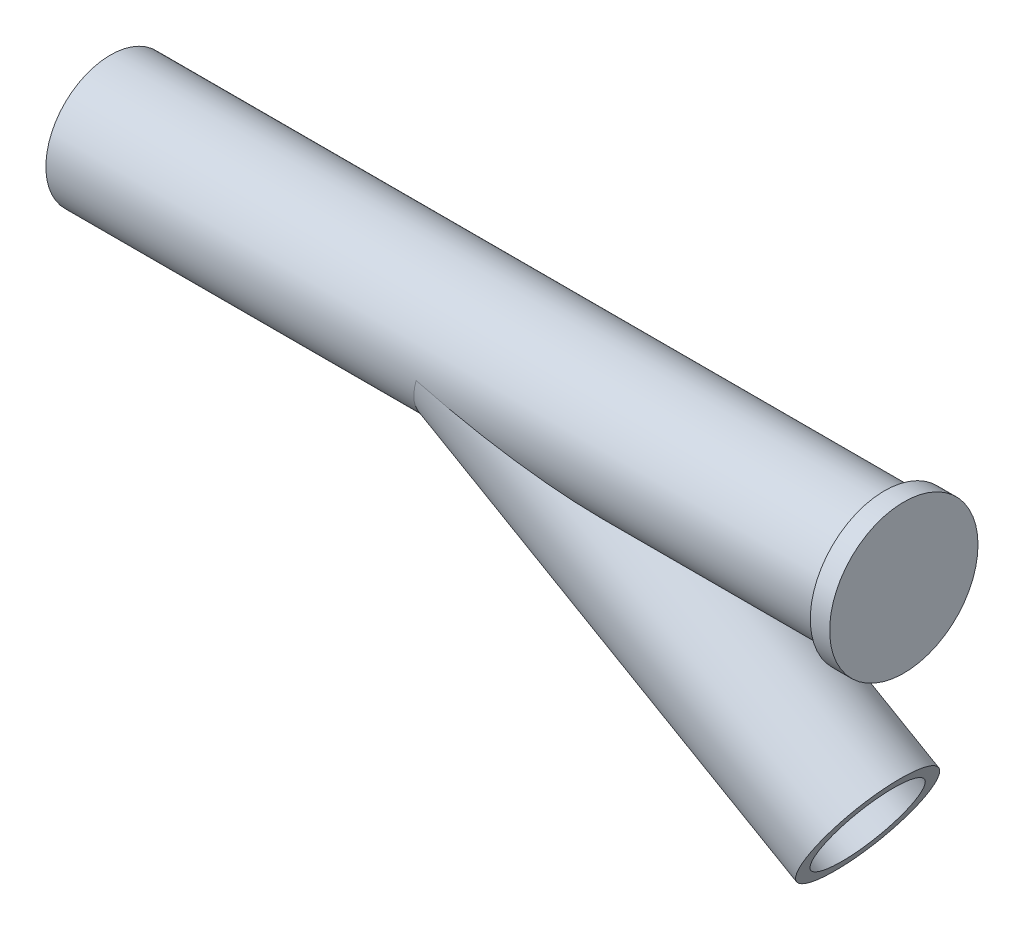
ISO-10303-21;
HEADER;
FILE_DESCRIPTION(('STEP AP214'),'2;1');
FILE_NAME('part.step','',(''),(''),'','','');
FILE_SCHEMA(('AUTOMOTIVE_DESIGN { 1 0 10303 214 1 1 1 1 }'));
ENDSEC;
DATA;
#1=APPLICATION_CONTEXT('core data for automotive mechanical design processes');
#2=APPLICATION_PROTOCOL_DEFINITION('international standard','automotive_design',2000,#1);
#3=PRODUCT_CONTEXT('',#1,'mechanical');
#4=PRODUCT('Part','Part','',(#3));
#5=PRODUCT_RELATED_PRODUCT_CATEGORY('part','',(#4));
#6=PRODUCT_DEFINITION_FORMATION('','',#4);
#7=PRODUCT_DEFINITION_CONTEXT('part definition',#1,'design');
#8=PRODUCT_DEFINITION('design','',#6,#7);
#9=PRODUCT_DEFINITION_SHAPE('','',#8);
#10=(LENGTH_UNIT() NAMED_UNIT(*) SI_UNIT(.MILLI.,.METRE.));
#11=(NAMED_UNIT(*) PLANE_ANGLE_UNIT() SI_UNIT($,.RADIAN.));
#12=(NAMED_UNIT(*) SI_UNIT($,.STERADIAN.) SOLID_ANGLE_UNIT());
#13=UNCERTAINTY_MEASURE_WITH_UNIT(LENGTH_MEASURE(1.E-05),#10,'distance_accuracy_value','');
#14=(GEOMETRIC_REPRESENTATION_CONTEXT(3) GLOBAL_UNCERTAINTY_ASSIGNED_CONTEXT((#13)) GLOBAL_UNIT_ASSIGNED_CONTEXT((#10,
#11,#12)) REPRESENTATION_CONTEXT('',''));
#15=CARTESIAN_POINT('',(0.,0.,0.));
#16=DIRECTION('',(0.,0.,1.));
#17=DIRECTION('',(1.,0.,0.));
#18=AXIS2_PLACEMENT_3D('',#15,#16,#17);
#19=CARTESIAN_POINT('',(-5.73911589078347,0.,0.));
#20=DIRECTION('',(1.,0.,0.));
#21=DIRECTION('',(0.,0.,-1.));
#22=AXIS2_PLACEMENT_3D('',#19,#20,#21);
#23=PLANE('',#22);
#24=CARTESIAN_POINT('',(-5.73911589078347,0.,0.));
#25=DIRECTION('',(1.,0.,0.));
#26=DIRECTION('',(0.,0.,-1.));
#27=AXIS2_PLACEMENT_3D('',#24,#25,#26);
#28=CIRCLE('',#27,0.8);
#29=CARTESIAN_POINT('',(-5.73911589078347,0.,-0.8));
#30=VERTEX_POINT('',#29);
#31=EDGE_CURVE('E89',#30,#30,#28,.T.);
#32=ORIENTED_EDGE('',*,*,#31,.T.);
#33=EDGE_LOOP('',(#32));
#34=FACE_BOUND('',#33,.T.);
#35=CARTESIAN_POINT('',(-5.73911589078347,0.,0.));
#36=DIRECTION('',(1.,0.,0.));
#37=DIRECTION('',(0.,0.,-1.));
#38=AXIS2_PLACEMENT_3D('',#35,#36,#37);
#39=CIRCLE('',#38,1.);
#40=CARTESIAN_POINT('',(-5.73911589078347,0.,-1.));
#41=VERTEX_POINT('',#40);
#42=EDGE_CURVE('E108',#41,#41,#39,.T.);
#43=ORIENTED_EDGE('',*,*,#42,.F.);
#44=EDGE_LOOP('',(#43));
#45=FACE_BOUND('',#44,.T.);
#46=ADVANCED_FACE('F56',(#34,#45),#23,.F.);
#47=CARTESIAN_POINT('',(-5.73911589078347,0.,0.));
#48=DIRECTION('',(1.,0.,0.));
#49=DIRECTION('',(0.,0.,-1.));
#50=AXIS2_PLACEMENT_3D('',#47,#48,#49);
#51=CYLINDRICAL_SURFACE('',#50,1.);
#52=CARTESIAN_POINT('',(0.,0.,0.));
#53=DIRECTION('',(0.965925826289068,-0.258819045102521,0.));
#54=DIRECTION('',(0.258819045102521,0.965925826289068,0.));
#55=AXIS2_PLACEMENT_3D('',#52,#53,#54);
#56=ELLIPSE('',#55,1.03527618041008,1.);
#57=CARTESIAN_POINT('',(0.,0.,1.));
#58=VERTEX_POINT('',#57);
#59=CARTESIAN_POINT('',(0.,0.,-1.));
#60=VERTEX_POINT('',#59);
#61=EDGE_CURVE('E12',#58,#60,#56,.T.);
#62=ORIENTED_EDGE('',*,*,#61,.F.);
#63=CARTESIAN_POINT('',(0.,0.,0.));
#64=DIRECTION('',(0.258819045102521,0.965925826289068,0.));
#65=DIRECTION('',(0.965925826289068,-0.258819045102521,0.));
#66=AXIS2_PLACEMENT_3D('',#63,#64,#65);
#67=ELLIPSE('',#66,3.86370330515626,1.);
#68=EDGE_CURVE('E64',#60,#58,#67,.F.);
#69=ORIENTED_EDGE('',*,*,#68,.F.);
#70=EDGE_LOOP('',(#62,#69));
#71=FACE_BOUND('',#70,.T.);
#72=CARTESIAN_POINT('',(6.26088410921653,0.,0.));
#73=DIRECTION('',(1.,0.,0.));
#74=DIRECTION('',(0.,0.,-1.));
#75=AXIS2_PLACEMENT_3D('',#72,#73,#74);
#76=CIRCLE('',#75,1.);
#77=CARTESIAN_POINT('',(6.26088410921653,0.,-1.));
#78=VERTEX_POINT('',#77);
#79=EDGE_CURVE('E112',#78,#78,#76,.T.);
#80=ORIENTED_EDGE('',*,*,#79,.F.);
#81=EDGE_LOOP('',(#80));
#82=FACE_BOUND('',#81,.T.);
#83=ORIENTED_EDGE('',*,*,#42,.T.);
#84=EDGE_LOOP('',(#83));
#85=FACE_BOUND('',#84,.T.);
#86=ADVANCED_FACE('F127',(#71,#82,#85),#51,.T.);
#87=CARTESIAN_POINT('',(6.,-3.46410161513776,0.));
#88=DIRECTION('',(0.866025403784438,-0.500000000000001,0.));
#89=DIRECTION('',(0.500000000000001,0.866025403784438,0.));
#90=AXIS2_PLACEMENT_3D('',#87,#88,#89);
#91=PLANE('',#90);
#92=CARTESIAN_POINT('',(6.,-3.46410161513776,0.));
#93=DIRECTION('',(0.866025403784438,-0.500000000000001,0.));
#94=DIRECTION('',(0.500000000000001,0.866025403784438,0.));
#95=AXIS2_PLACEMENT_3D('',#92,#93,#94);
#96=CIRCLE('',#95,0.8);
#97=CARTESIAN_POINT('',(6.4,-2.77128129211021,0.));
#98=VERTEX_POINT('',#97);
#99=EDGE_CURVE('E93',#98,#98,#96,.T.);
#100=ORIENTED_EDGE('',*,*,#99,.F.);
#101=EDGE_LOOP('',(#100));
#102=FACE_BOUND('',#101,.T.);
#103=CARTESIAN_POINT('',(6.,-3.46410161513776,0.));
#104=DIRECTION('',(0.866025403784438,-0.500000000000001,0.));
#105=DIRECTION('',(0.500000000000001,0.866025403784438,0.));
#106=AXIS2_PLACEMENT_3D('',#103,#104,#105);
#107=CIRCLE('',#106,1.);
#108=CARTESIAN_POINT('',(6.5,-2.59807621135333,0.));
#109=VERTEX_POINT('',#108);
#110=EDGE_CURVE('E84',#109,#109,#107,.T.);
#111=ORIENTED_EDGE('',*,*,#110,.T.);
#112=EDGE_LOOP('',(#111));
#113=FACE_BOUND('',#112,.T.);
#114=ADVANCED_FACE('F119',(#102,#113),#91,.T.);
#115=CARTESIAN_POINT('',(0.,0.,0.));
#116=DIRECTION('',(0.866025403784438,-0.500000000000001,0.));
#117=DIRECTION('',(0.500000000000001,0.866025403784438,0.));
#118=AXIS2_PLACEMENT_3D('',#115,#116,#117);
#119=CYLINDRICAL_SURFACE('',#118,1.);
#120=ORIENTED_EDGE('',*,*,#110,.F.);
#121=EDGE_LOOP('',(#120));
#122=FACE_BOUND('',#121,.T.);
#123=ORIENTED_EDGE('',*,*,#68,.T.);
#124=ORIENTED_EDGE('',*,*,#61,.T.);
#125=EDGE_LOOP('',(#123,#124));
#126=FACE_BOUND('',#125,.T.);
#127=ADVANCED_FACE('F117',(#122,#126),#119,.T.);
#128=CARTESIAN_POINT('',(-5.73911589078347,0.,0.));
#129=DIRECTION('',(1.,0.,0.));
#130=DIRECTION('',(0.,0.,-1.));
#131=AXIS2_PLACEMENT_3D('',#128,#129,#130);
#132=CYLINDRICAL_SURFACE('',#131,0.8);
#133=CARTESIAN_POINT('',(0.,0.,0.));
#134=DIRECTION('',(0.965925826289068,-0.258819045102521,0.));
#135=DIRECTION('',(0.258819045102521,0.965925826289068,0.));
#136=AXIS2_PLACEMENT_3D('',#133,#134,#135);
#137=ELLIPSE('',#136,0.828220944328067,0.8);
#138=CARTESIAN_POINT('',(0.,0.,0.8));
#139=VERTEX_POINT('',#138);
#140=CARTESIAN_POINT('',(0.,0.,-0.8));
#141=VERTEX_POINT('',#140);
#142=EDGE_CURVE('E78',#139,#141,#137,.T.);
#143=ORIENTED_EDGE('',*,*,#142,.T.);
#144=CARTESIAN_POINT('',(0.,0.,0.));
#145=DIRECTION('',(0.258819045102521,0.965925826289068,0.));
#146=DIRECTION('',(0.965925826289068,-0.258819045102521,0.));
#147=AXIS2_PLACEMENT_3D('',#144,#145,#146);
#148=ELLIPSE('',#147,3.09096264412501,0.8);
#149=EDGE_CURVE('E81',#141,#139,#148,.F.);
#150=ORIENTED_EDGE('',*,*,#149,.T.);
#151=EDGE_LOOP('',(#143,#150));
#152=FACE_BOUND('',#151,.T.);
#153=CARTESIAN_POINT('',(6.26088410921653,0.,0.));
#154=DIRECTION('',(1.,0.,0.));
#155=DIRECTION('',(0.,0.,-1.));
#156=AXIS2_PLACEMENT_3D('',#153,#154,#155);
#157=CIRCLE('',#156,0.8);
#158=CARTESIAN_POINT('',(6.26088410921653,0.,-0.8));
#159=VERTEX_POINT('',#158);
#160=EDGE_CURVE('E97',#159,#159,#157,.T.);
#161=ORIENTED_EDGE('',*,*,#160,.T.);
#162=EDGE_LOOP('',(#161));
#163=FACE_BOUND('',#162,.T.);
#164=ORIENTED_EDGE('',*,*,#31,.F.);
#165=EDGE_LOOP('',(#164));
#166=FACE_BOUND('',#165,.T.);
#167=ADVANCED_FACE('F86',(#152,#163,#166),#132,.F.);
#168=CARTESIAN_POINT('',(0.,0.,0.));
#169=DIRECTION('',(0.866025403784438,-0.500000000000001,0.));
#170=DIRECTION('',(0.500000000000001,0.866025403784438,0.));
#171=AXIS2_PLACEMENT_3D('',#168,#169,#170);
#172=CYLINDRICAL_SURFACE('',#171,0.8);
#173=ORIENTED_EDGE('',*,*,#99,.T.);
#174=EDGE_LOOP('',(#173));
#175=FACE_BOUND('',#174,.T.);
#176=ORIENTED_EDGE('',*,*,#149,.F.);
#177=ORIENTED_EDGE('',*,*,#142,.F.);
#178=EDGE_LOOP('',(#176,#177));
#179=FACE_BOUND('',#178,.T.);
#180=ADVANCED_FACE('F80',(#175,#179),#172,.F.);
#181=CARTESIAN_POINT('',(6.26088410921653,0.,0.));
#182=DIRECTION('',(1.,0.,0.));
#183=DIRECTION('',(0.,0.,-1.));
#184=AXIS2_PLACEMENT_3D('',#181,#182,#183);
#185=PLANE('',#184);
#186=ORIENTED_EDGE('',*,*,#79,.T.);
#187=EDGE_LOOP('',(#186));
#188=FACE_BOUND('',#187,.T.);
#189=CARTESIAN_POINT('',(6.26088410921653,0.,0.));
#190=DIRECTION('',(1.,0.,0.));
#191=DIRECTION('',(0.,0.,-1.));
#192=AXIS2_PLACEMENT_3D('',#189,#190,#191);
#193=CIRCLE('',#192,1.15);
#194=CARTESIAN_POINT('',(6.26088410921653,0.,-1.15));
#195=VERTEX_POINT('',#194);
#196=EDGE_CURVE('E151',#195,#195,#193,.T.);
#197=ORIENTED_EDGE('',*,*,#196,.F.);
#198=EDGE_LOOP('',(#197));
#199=FACE_BOUND('',#198,.T.);
#200=ADVANCED_FACE('F143',(#188,#199),#185,.F.);
#201=CARTESIAN_POINT('',(6.56088410921653,0.,0.));
#202=DIRECTION('',(1.,0.,0.));
#203=DIRECTION('',(0.,0.,-1.));
#204=AXIS2_PLACEMENT_3D('',#201,#202,#203);
#205=PLANE('',#204);
#206=CARTESIAN_POINT('',(6.56088410921653,0.,0.));
#207=DIRECTION('',(1.,0.,0.));
#208=DIRECTION('',(0.,0.,-1.));
#209=AXIS2_PLACEMENT_3D('',#206,#207,#208);
#210=CIRCLE('',#209,1.15);
#211=CARTESIAN_POINT('',(6.56088410921653,0.,-1.15));
#212=VERTEX_POINT('',#211);
#213=EDGE_CURVE('E100',#212,#212,#210,.T.);
#214=ORIENTED_EDGE('',*,*,#213,.T.);
#215=EDGE_LOOP('',(#214));
#216=FACE_BOUND('',#215,.T.);
#217=ADVANCED_FACE('F146',(#216),#205,.T.);
#218=CARTESIAN_POINT('',(6.56088410921653,0.,0.));
#219=DIRECTION('',(-1.,0.,0.));
#220=DIRECTION('',(0.,0.,1.));
#221=AXIS2_PLACEMENT_3D('',#218,#219,#220);
#222=CYLINDRICAL_SURFACE('',#221,1.15);
#223=ORIENTED_EDGE('',*,*,#213,.F.);
#224=EDGE_LOOP('',(#223));
#225=FACE_BOUND('',#224,.T.);
#226=ORIENTED_EDGE('',*,*,#196,.T.);
#227=EDGE_LOOP('',(#226));
#228=FACE_BOUND('',#227,.T.);
#229=ADVANCED_FACE('F160',(#225,#228),#222,.T.);
#230=ORIENTED_EDGE('',*,*,#160,.F.);
#231=EDGE_LOOP('',(#230));
#232=FACE_BOUND('',#231,.T.);
#233=ADVANCED_FACE('F148',(#232),#185,.F.);
#234=CLOSED_SHELL('',(#46,#86,#114,#127,#167,#180,#200,#217,#229,#233));
#235=MANIFOLD_SOLID_BREP('B2',#234);
#236=ADVANCED_BREP_SHAPE_REPRESENTATION('',(#18,#235),#14);
#237=SHAPE_DEFINITION_REPRESENTATION(#9,#236);
ENDSEC;
END-ISO-10303-21;
